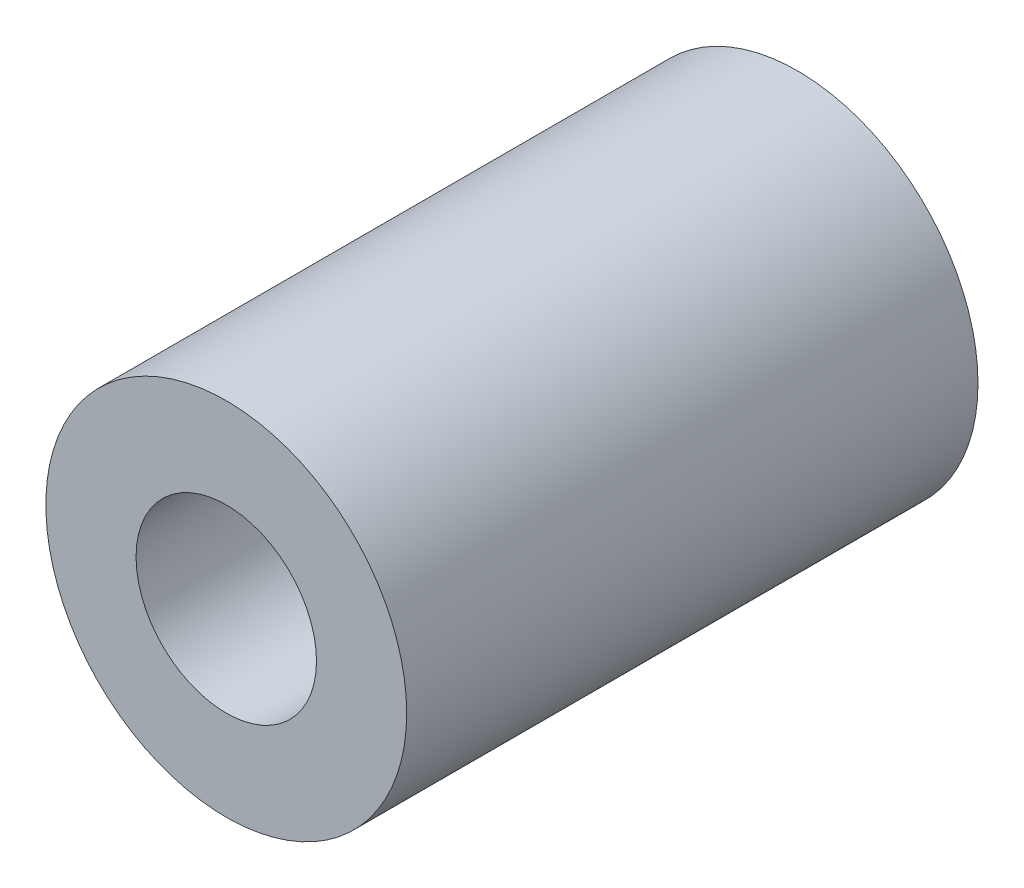
ISO-10303-21;
HEADER;
FILE_DESCRIPTION(('STEP AP214'),'2;1');
FILE_NAME('part.step','',(''),(''),'','','');
FILE_SCHEMA(('AUTOMOTIVE_DESIGN { 1 0 10303 214 1 1 1 1 }'));
ENDSEC;
DATA;
#1=APPLICATION_CONTEXT('core data for automotive mechanical design processes');
#2=APPLICATION_PROTOCOL_DEFINITION('international standard','automotive_design',2000,#1);
#3=PRODUCT_CONTEXT('',#1,'mechanical');
#4=PRODUCT('Part','Part','',(#3));
#5=PRODUCT_RELATED_PRODUCT_CATEGORY('part','',(#4));
#6=PRODUCT_DEFINITION_FORMATION('','',#4);
#7=PRODUCT_DEFINITION_CONTEXT('part definition',#1,'design');
#8=PRODUCT_DEFINITION('design','',#6,#7);
#9=PRODUCT_DEFINITION_SHAPE('','',#8);
#10=(LENGTH_UNIT() NAMED_UNIT(*) SI_UNIT(.MILLI.,.METRE.));
#11=(NAMED_UNIT(*) PLANE_ANGLE_UNIT() SI_UNIT($,.RADIAN.));
#12=(NAMED_UNIT(*) SI_UNIT($,.STERADIAN.) SOLID_ANGLE_UNIT());
#13=UNCERTAINTY_MEASURE_WITH_UNIT(LENGTH_MEASURE(1.E-05),#10,'distance_accuracy_value','');
#14=(GEOMETRIC_REPRESENTATION_CONTEXT(3) GLOBAL_UNCERTAINTY_ASSIGNED_CONTEXT((#13)) GLOBAL_UNIT_ASSIGNED_CONTEXT((#10,
#11,#12)) REPRESENTATION_CONTEXT('',''));
#15=CARTESIAN_POINT('',(0.,0.,0.));
#16=DIRECTION('',(0.,0.,1.));
#17=DIRECTION('',(1.,0.,0.));
#18=AXIS2_PLACEMENT_3D('',#15,#16,#17);
#19=CARTESIAN_POINT('',(0.,0.,19.));
#20=DIRECTION('',(0.,0.,1.));
#21=DIRECTION('',(1.,0.,0.));
#22=AXIS2_PLACEMENT_3D('',#19,#20,#21);
#23=PLANE('',#22);
#24=CARTESIAN_POINT('',(0.,0.,19.));
#25=DIRECTION('',(0.,0.,1.));
#26=DIRECTION('',(1.,0.,0.));
#27=AXIS2_PLACEMENT_3D('',#24,#25,#26);
#28=CIRCLE('',#27,6.);
#29=CARTESIAN_POINT('',(6.,0.,19.));
#30=VERTEX_POINT('',#29);
#31=EDGE_CURVE('E10',#30,#30,#28,.T.);
#32=ORIENTED_EDGE('',*,*,#31,.T.);
#33=EDGE_LOOP('',(#32));
#34=FACE_BOUND('',#33,.T.);
#35=CARTESIAN_POINT('',(0.,0.,19.));
#36=DIRECTION('',(0.,0.,1.));
#37=DIRECTION('',(1.,0.,0.));
#38=AXIS2_PLACEMENT_3D('',#35,#36,#37);
#39=CIRCLE('',#38,3.);
#40=CARTESIAN_POINT('',(3.,0.,19.));
#41=VERTEX_POINT('',#40);
#42=EDGE_CURVE('E50',#41,#41,#39,.T.);
#43=ORIENTED_EDGE('',*,*,#42,.F.);
#44=EDGE_LOOP('',(#43));
#45=FACE_BOUND('',#44,.T.);
#46=ADVANCED_FACE('F37',(#34,#45),#23,.T.);
#47=CARTESIAN_POINT('',(0.,0.,0.));
#48=DIRECTION('',(0.,0.,1.));
#49=DIRECTION('',(1.,0.,0.));
#50=AXIS2_PLACEMENT_3D('',#47,#48,#49);
#51=PLANE('',#50);
#52=CARTESIAN_POINT('',(0.,0.,0.));
#53=DIRECTION('',(0.,0.,1.));
#54=DIRECTION('',(1.,0.,0.));
#55=AXIS2_PLACEMENT_3D('',#52,#53,#54);
#56=CIRCLE('',#55,6.);
#57=CARTESIAN_POINT('',(6.,0.,0.));
#58=VERTEX_POINT('',#57);
#59=EDGE_CURVE('E41',#58,#58,#56,.T.);
#60=ORIENTED_EDGE('',*,*,#59,.F.);
#61=EDGE_LOOP('',(#60));
#62=FACE_BOUND('',#61,.T.);
#63=CARTESIAN_POINT('',(0.,0.,0.));
#64=DIRECTION('',(0.,0.,1.));
#65=DIRECTION('',(1.,0.,0.));
#66=AXIS2_PLACEMENT_3D('',#63,#64,#65);
#67=CIRCLE('',#66,3.);
#68=CARTESIAN_POINT('',(3.,0.,0.));
#69=VERTEX_POINT('',#68);
#70=EDGE_CURVE('E52',#69,#69,#67,.T.);
#71=ORIENTED_EDGE('',*,*,#70,.T.);
#72=EDGE_LOOP('',(#71));
#73=FACE_BOUND('',#72,.T.);
#74=ADVANCED_FACE('F64',(#62,#73),#51,.F.);
#75=CARTESIAN_POINT('',(0.,0.,19.));
#76=DIRECTION('',(0.,0.,-1.));
#77=DIRECTION('',(-1.,0.,0.));
#78=AXIS2_PLACEMENT_3D('',#75,#76,#77);
#79=CYLINDRICAL_SURFACE('',#78,6.);
#80=ORIENTED_EDGE('',*,*,#31,.F.);
#81=EDGE_LOOP('',(#80));
#82=FACE_BOUND('',#81,.T.);
#83=ORIENTED_EDGE('',*,*,#59,.T.);
#84=EDGE_LOOP('',(#83));
#85=FACE_BOUND('',#84,.T.);
#86=ADVANCED_FACE('F39',(#82,#85),#79,.T.);
#87=CARTESIAN_POINT('',(0.,0.,19.));
#88=DIRECTION('',(0.,0.,-1.));
#89=DIRECTION('',(-1.,0.,0.));
#90=AXIS2_PLACEMENT_3D('',#87,#88,#89);
#91=CYLINDRICAL_SURFACE('',#90,3.);
#92=ORIENTED_EDGE('',*,*,#42,.T.);
#93=EDGE_LOOP('',(#92));
#94=FACE_BOUND('',#93,.T.);
#95=ORIENTED_EDGE('',*,*,#70,.F.);
#96=EDGE_LOOP('',(#95));
#97=FACE_BOUND('',#96,.T.);
#98=ADVANCED_FACE('F60',(#94,#97),#91,.F.);
#99=CLOSED_SHELL('',(#46,#74,#86,#98));
#100=MANIFOLD_SOLID_BREP('B2',#99);
#101=ADVANCED_BREP_SHAPE_REPRESENTATION('',(#18,#100),#14);
#102=SHAPE_DEFINITION_REPRESENTATION(#9,#101);
ENDSEC;
END-ISO-10303-21;
